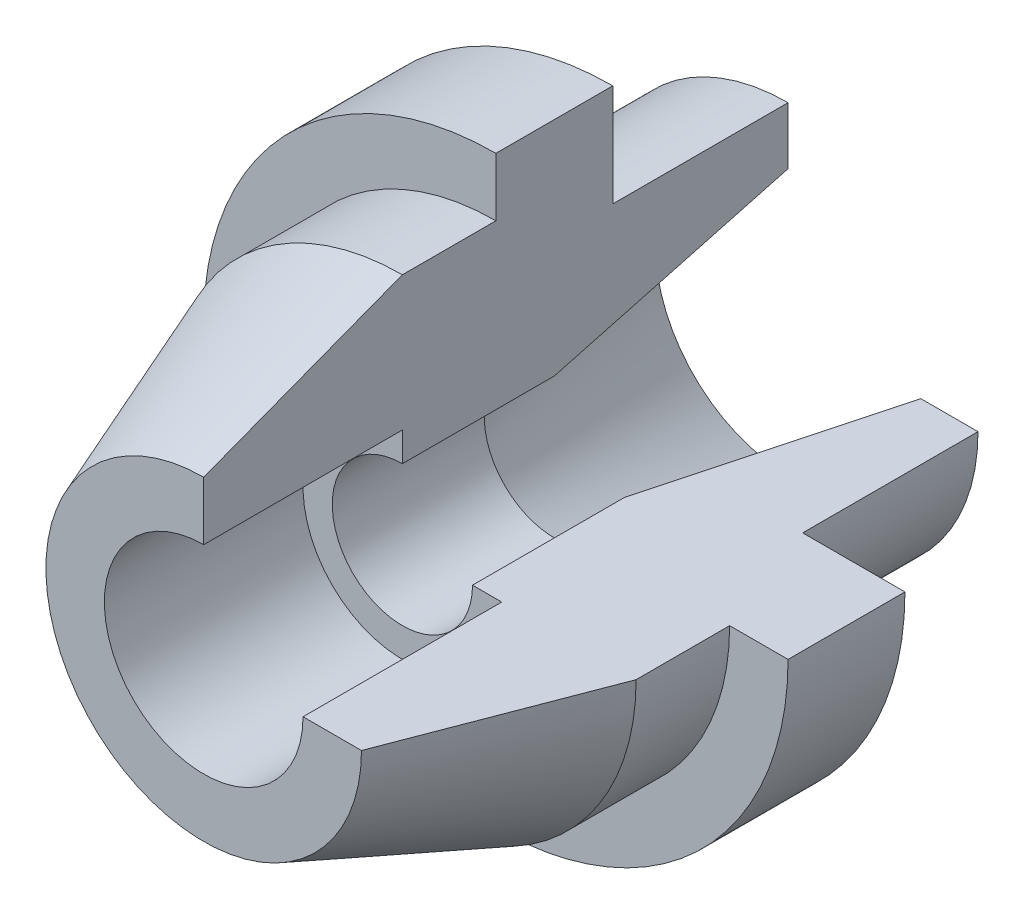
ISO-10303-21;
HEADER;
FILE_DESCRIPTION(('STEP AP214'),'2;1');
FILE_NAME('part.step','',(''),(''),'','','');
FILE_SCHEMA(('AUTOMOTIVE_DESIGN { 1 0 10303 214 1 1 1 1 }'));
ENDSEC;
DATA;
#1=APPLICATION_CONTEXT('core data for automotive mechanical design processes');
#2=APPLICATION_PROTOCOL_DEFINITION('international standard','automotive_design',2000,#1);
#3=PRODUCT_CONTEXT('',#1,'mechanical');
#4=PRODUCT('Part','Part','',(#3));
#5=PRODUCT_RELATED_PRODUCT_CATEGORY('part','',(#4));
#6=PRODUCT_DEFINITION_FORMATION('','',#4);
#7=PRODUCT_DEFINITION_CONTEXT('part definition',#1,'design');
#8=PRODUCT_DEFINITION('design','',#6,#7);
#9=PRODUCT_DEFINITION_SHAPE('','',#8);
#10=(LENGTH_UNIT() NAMED_UNIT(*) SI_UNIT(.MILLI.,.METRE.));
#11=(NAMED_UNIT(*) PLANE_ANGLE_UNIT() SI_UNIT($,.RADIAN.));
#12=(NAMED_UNIT(*) SI_UNIT($,.STERADIAN.) SOLID_ANGLE_UNIT());
#13=UNCERTAINTY_MEASURE_WITH_UNIT(LENGTH_MEASURE(1.E-05),#10,'distance_accuracy_value','');
#14=(GEOMETRIC_REPRESENTATION_CONTEXT(3) GLOBAL_UNCERTAINTY_ASSIGNED_CONTEXT((#13)) GLOBAL_UNIT_ASSIGNED_CONTEXT((#10,
#11,#12)) REPRESENTATION_CONTEXT('',''));
#15=CARTESIAN_POINT('',(0.,0.,0.));
#16=DIRECTION('',(0.,0.,1.));
#17=DIRECTION('',(1.,0.,0.));
#18=AXIS2_PLACEMENT_3D('',#15,#16,#17);
#19=CARTESIAN_POINT('',(0.,0.,0.));
#20=DIRECTION('',(0.,1.,0.));
#21=DIRECTION('',(0.,0.,1.));
#22=AXIS2_PLACEMENT_3D('',#19,#20,#21);
#23=PLANE('',#22);
#24=DIRECTION('',(1.,0.,0.));
#25=VECTOR('',#24,1.);
#26=CARTESIAN_POINT('',(0.,0.,-34.));
#27=LINE('',#26,#25);
#28=CARTESIAN_POINT('',(11.9999999999998,1.25547595229252E-13,-34.));
#29=VERTEX_POINT('',#28);
#30=CARTESIAN_POINT('',(17.0000000000001,1.77919815311902E-13,-34.));
#31=VERTEX_POINT('',#30);
#32=EDGE_CURVE('E145',#29,#31,#27,.T.);
#33=ORIENTED_EDGE('',*,*,#32,.T.);
#34=DIRECTION('',(0.,0.,1.));
#35=VECTOR('',#34,1.);
#36=CARTESIAN_POINT('',(17.,1.78065548281E-13,0.));
#37=LINE('',#36,#35);
#38=CARTESIAN_POINT('',(17.,1.78065548281E-13,0.));
#39=VERTEX_POINT('',#38);
#40=EDGE_CURVE('E126',#31,#39,#37,.T.);
#41=ORIENTED_EDGE('',*,*,#40,.T.);
#42=DIRECTION('',(-1.,0.,0.));
#43=VECTOR('',#42,1.);
#44=CARTESIAN_POINT('',(0.,0.,0.));
#45=LINE('',#44,#43);
#46=CARTESIAN_POINT('',(27.,2.82809988446294E-13,0.));
#47=VERTEX_POINT('',#46);
#48=EDGE_CURVE('E200',#47,#39,#45,.T.);
#49=ORIENTED_EDGE('',*,*,#48,.F.);
#50=DIRECTION('',(-0.357137466266591,0.,0.934051834851085));
#51=VECTOR('',#50,1.);
#52=CARTESIAN_POINT('',(27.,2.82809988446294E-13,0.));
#53=LINE('',#52,#51);
#54=CARTESIAN_POINT('',(40.,4.18832027692077E-13,-34.));
#55=VERTEX_POINT('',#54);
#56=EDGE_CURVE('E193',#55,#47,#53,.T.);
#57=ORIENTED_EDGE('',*,*,#56,.F.);
#58=DIRECTION('',(0.,0.,1.));
#59=VECTOR('',#58,1.);
#60=CARTESIAN_POINT('',(40.,4.18832027692077E-13,-34.));
#61=LINE('',#60,#59);
#62=CARTESIAN_POINT('',(40.,4.18763447471325E-13,-50.));
#63=VERTEX_POINT('',#62);
#64=EDGE_CURVE('E195',#63,#55,#61,.T.);
#65=ORIENTED_EDGE('',*,*,#64,.F.);
#66=DIRECTION('',(-1.,0.,0.));
#67=VECTOR('',#66,1.);
#68=CARTESIAN_POINT('',(40.,4.18763447471325E-13,-50.));
#69=LINE('',#68,#67);
#70=CARTESIAN_POINT('',(50.,5.23507887636619E-13,-50.));
#71=VERTEX_POINT('',#70);
#72=EDGE_CURVE('E188',#71,#63,#69,.T.);
#73=ORIENTED_EDGE('',*,*,#72,.F.);
#74=DIRECTION('',(0.,0.,1.));
#75=VECTOR('',#74,1.);
#76=CARTESIAN_POINT('',(50.,5.23507887636619E-13,-50.));
#77=LINE('',#76,#75);
#78=CARTESIAN_POINT('',(50.,5.23422162360679E-13,-70.));
#79=VERTEX_POINT('',#78);
#80=EDGE_CURVE('E186',#79,#71,#77,.T.);
#81=ORIENTED_EDGE('',*,*,#80,.F.);
#82=DIRECTION('',(1.,0.,0.));
#83=VECTOR('',#82,1.);
#84=CARTESIAN_POINT('',(50.,5.23422162360679E-13,-70.));
#85=LINE('',#84,#83);
#86=CARTESIAN_POINT('',(32.5,3.40119392071414E-13,-70.));
#87=VERTEX_POINT('',#86);
#88=EDGE_CURVE('E183',#87,#79,#85,.T.);
#89=ORIENTED_EDGE('',*,*,#88,.F.);
#90=DIRECTION('',(0.,0.,1.));
#91=VECTOR('',#90,1.);
#92=CARTESIAN_POINT('',(32.5,3.40119392071414E-13,-70.));
#93=LINE('',#92,#91);
#94=CARTESIAN_POINT('',(32.5,3.39990804157504E-13,-100.));
#95=VERTEX_POINT('',#94);
#96=EDGE_CURVE('E179',#95,#87,#93,.T.);
#97=ORIENTED_EDGE('',*,*,#96,.F.);
#98=DIRECTION('',(1.,0.,0.));
#99=VECTOR('',#98,1.);
#100=CARTESIAN_POINT('',(32.5,3.39990804157504E-13,-100.));
#101=LINE('',#100,#99);
#102=CARTESIAN_POINT('',(22.7179676972446,2.37529454434411E-13,-99.9999999999999));
#103=VERTEX_POINT('',#102);
#104=EDGE_CURVE('E178',#103,#95,#101,.T.);
#105=ORIENTED_EDGE('',*,*,#104,.F.);
#106=DIRECTION('',(0.258819045102517,0.,-0.965925826289069));
#107=VECTOR('',#106,1.);
#108=CARTESIAN_POINT('',(0.,0.,-15.2153903091732));
#109=LINE('',#108,#107);
#110=CARTESIAN_POINT('',(11.9999999999999,0.,-60.));
#111=VERTEX_POINT('',#110);
#112=EDGE_CURVE('E137',#103,#111,#109,.F.);
#113=ORIENTED_EDGE('',*,*,#112,.T.);
#114=DIRECTION('',(0.,0.,1.));
#115=VECTOR('',#114,1.);
#116=CARTESIAN_POINT('',(11.9999999999998,1.25693328198351E-13,0.));
#117=LINE('',#116,#115);
#118=EDGE_CURVE('E149',#111,#29,#117,.T.);
#119=ORIENTED_EDGE('',*,*,#118,.T.);
#120=EDGE_LOOP('',(#33,#41,#49,#57,#65,#73,#81,#89,#97,#105,#113,#119));
#121=FACE_BOUND('',#120,.T.);
#122=ADVANCED_FACE('F39',(#121),#23,.T.);
#123=CARTESIAN_POINT('',(0.,0.,0.));
#124=DIRECTION('',(-1.,0.,0.));
#125=DIRECTION('',(0.,0.,1.));
#126=AXIS2_PLACEMENT_3D('',#123,#124,#125);
#127=PLANE('',#126);
#128=DIRECTION('',(0.,0.,1.));
#129=VECTOR('',#128,1.);
#130=CARTESIAN_POINT('',(0.,17.0000000000003,0.));
#131=LINE('',#130,#129);
#132=CARTESIAN_POINT('',(0.,17.0000000000003,-34.));
#133=VERTEX_POINT('',#132);
#134=CARTESIAN_POINT('',(0.,17.0000000000003,0.));
#135=VERTEX_POINT('',#134);
#136=EDGE_CURVE('E11',#133,#135,#131,.T.);
#137=ORIENTED_EDGE('',*,*,#136,.F.);
#138=DIRECTION('',(0.,1.,0.));
#139=VECTOR('',#138,1.);
#140=CARTESIAN_POINT('',(0.,0.,-34.));
#141=LINE('',#140,#139);
#142=CARTESIAN_POINT('',(0.,12.,-34.));
#143=VERTEX_POINT('',#142);
#144=EDGE_CURVE('E143',#143,#133,#141,.T.);
#145=ORIENTED_EDGE('',*,*,#144,.F.);
#146=DIRECTION('',(0.,0.,1.));
#147=VECTOR('',#146,1.);
#148=CARTESIAN_POINT('',(0.,12.0000000000001,0.));
#149=LINE('',#148,#147);
#150=CARTESIAN_POINT('',(0.,12.,-60.));
#151=VERTEX_POINT('',#150);
#152=EDGE_CURVE('E215',#151,#143,#149,.T.);
#153=ORIENTED_EDGE('',*,*,#152,.F.);
#154=DIRECTION('',(0.,0.258819045102515,-0.96592582628907));
#155=VECTOR('',#154,1.);
#156=CARTESIAN_POINT('',(0.,2.39779344870862E-13,-15.2153903091732));
#157=LINE('',#156,#155);
#158=CARTESIAN_POINT('',(0.,22.7179676972446,-100.));
#159=VERTEX_POINT('',#158);
#160=EDGE_CURVE('E50',#159,#151,#157,.F.);
#161=ORIENTED_EDGE('',*,*,#160,.F.);
#162=DIRECTION('',(0.,1.,0.));
#163=VECTOR('',#162,1.);
#164=CARTESIAN_POINT('',(0.,32.5,-100.));
#165=LINE('',#164,#163);
#166=CARTESIAN_POINT('',(0.,32.5,-100.));
#167=VERTEX_POINT('',#166);
#168=EDGE_CURVE('E138',#159,#167,#165,.T.);
#169=ORIENTED_EDGE('',*,*,#168,.T.);
#170=DIRECTION('',(0.,0.,1.));
#171=VECTOR('',#170,1.);
#172=CARTESIAN_POINT('',(0.,32.5,-70.));
#173=LINE('',#172,#171);
#174=CARTESIAN_POINT('',(0.,32.5,-70.));
#175=VERTEX_POINT('',#174);
#176=EDGE_CURVE('E160',#167,#175,#173,.T.);
#177=ORIENTED_EDGE('',*,*,#176,.T.);
#178=DIRECTION('',(0.,1.,0.));
#179=VECTOR('',#178,1.);
#180=CARTESIAN_POINT('',(0.,50.,-70.));
#181=LINE('',#180,#179);
#182=CARTESIAN_POINT('',(0.,50.,-70.));
#183=VERTEX_POINT('',#182);
#184=EDGE_CURVE('E158',#175,#183,#181,.T.);
#185=ORIENTED_EDGE('',*,*,#184,.T.);
#186=DIRECTION('',(0.,0.,1.));
#187=VECTOR('',#186,1.);
#188=CARTESIAN_POINT('',(0.,50.,-50.));
#189=LINE('',#188,#187);
#190=CARTESIAN_POINT('',(0.,50.,-50.));
#191=VERTEX_POINT('',#190);
#192=EDGE_CURVE('E161',#183,#191,#189,.T.);
#193=ORIENTED_EDGE('',*,*,#192,.T.);
#194=DIRECTION('',(0.,-1.,0.));
#195=VECTOR('',#194,1.);
#196=CARTESIAN_POINT('',(0.,40.,-50.));
#197=LINE('',#196,#195);
#198=CARTESIAN_POINT('',(0.,40.,-50.));
#199=VERTEX_POINT('',#198);
#200=EDGE_CURVE('E168',#191,#199,#197,.T.);
#201=ORIENTED_EDGE('',*,*,#200,.T.);
#202=DIRECTION('',(0.,0.,1.));
#203=VECTOR('',#202,1.);
#204=CARTESIAN_POINT('',(0.,40.,-34.));
#205=LINE('',#204,#203);
#206=CARTESIAN_POINT('',(0.,40.,-34.));
#207=VERTEX_POINT('',#206);
#208=EDGE_CURVE('E170',#199,#207,#205,.T.);
#209=ORIENTED_EDGE('',*,*,#208,.T.);
#210=DIRECTION('',(0.,-0.357137466266591,0.934051834851085));
#211=VECTOR('',#210,1.);
#212=CARTESIAN_POINT('',(0.,27.,0.));
#213=LINE('',#212,#211);
#214=CARTESIAN_POINT('',(0.,27.,0.));
#215=VERTEX_POINT('',#214);
#216=EDGE_CURVE('E175',#207,#215,#213,.T.);
#217=ORIENTED_EDGE('',*,*,#216,.T.);
#218=DIRECTION('',(0.,-1.,0.));
#219=VECTOR('',#218,1.);
#220=CARTESIAN_POINT('',(0.,0.,0.));
#221=LINE('',#220,#219);
#222=EDGE_CURVE('E172',#215,#135,#221,.T.);
#223=ORIENTED_EDGE('',*,*,#222,.T.);
#224=EDGE_LOOP('',(#137,#145,#153,#161,#169,#177,#185,#193,#201,#209,#217,#223));
#225=FACE_BOUND('',#224,.T.);
#226=ADVANCED_FACE('F228',(#225),#127,.F.);
#227=CARTESIAN_POINT('',(0.,0.,0.));
#228=DIRECTION('',(0.,0.,1.));
#229=DIRECTION('',(0.,-1.,0.));
#230=AXIS2_PLACEMENT_3D('',#227,#228,#229);
#231=PLANE('',#230);
#232=ORIENTED_EDGE('',*,*,#48,.T.);
#233=CARTESIAN_POINT('',(0.,2.82809988446294E-13,0.));
#234=DIRECTION('',(0.,0.,1.));
#235=DIRECTION('',(0.,-1.,0.));
#236=AXIS2_PLACEMENT_3D('',#233,#234,#235);
#237=CIRCLE('',#236,17.);
#238=EDGE_CURVE('E132',#135,#39,#237,.T.);
#239=ORIENTED_EDGE('',*,*,#238,.F.);
#240=ORIENTED_EDGE('',*,*,#222,.F.);
#241=CARTESIAN_POINT('',(0.,0.,0.));
#242=DIRECTION('',(0.,0.,-1.));
#243=DIRECTION('',(0.,1.,0.));
#244=AXIS2_PLACEMENT_3D('',#241,#242,#243);
#245=CIRCLE('',#244,27.);
#246=EDGE_CURVE('E65',#47,#215,#245,.T.);
#247=ORIENTED_EDGE('',*,*,#246,.F.);
#248=EDGE_LOOP('',(#232,#239,#240,#247));
#249=FACE_BOUND('',#248,.T.);
#250=ADVANCED_FACE('F41',(#249),#231,.T.);
#251=CARTESIAN_POINT('',(0.,0.,-34.));
#252=DIRECTION('',(0.,0.,-1.));
#253=DIRECTION('',(0.,1.,0.));
#254=AXIS2_PLACEMENT_3D('',#251,#252,#253);
#255=CONICAL_SURFACE('',#254,40.,0.365201449788173);
#256=CARTESIAN_POINT('',(0.,0.,-34.));
#257=DIRECTION('',(0.,0.,-1.));
#258=DIRECTION('',(0.,1.,0.));
#259=AXIS2_PLACEMENT_3D('',#256,#257,#258);
#260=CIRCLE('',#259,40.);
#261=EDGE_CURVE('E209',#55,#207,#260,.T.);
#262=ORIENTED_EDGE('',*,*,#261,.F.);
#263=ORIENTED_EDGE('',*,*,#56,.T.);
#264=ORIENTED_EDGE('',*,*,#246,.T.);
#265=ORIENTED_EDGE('',*,*,#216,.F.);
#266=EDGE_LOOP('',(#262,#263,#264,#265));
#267=FACE_BOUND('',#266,.T.);
#268=ADVANCED_FACE('F232',(#267),#255,.T.);
#269=CARTESIAN_POINT('',(0.,0.,-100.));
#270=DIRECTION('',(0.,0.,-1.));
#271=DIRECTION('',(0.,1.,0.));
#272=AXIS2_PLACEMENT_3D('',#269,#270,#271);
#273=CYLINDRICAL_SURFACE('',#272,40.);
#274=CARTESIAN_POINT('',(0.,0.,-50.));
#275=DIRECTION('',(0.,0.,-1.));
#276=DIRECTION('',(0.,1.,0.));
#277=AXIS2_PLACEMENT_3D('',#274,#275,#276);
#278=CIRCLE('',#277,40.);
#279=EDGE_CURVE('E206',#63,#199,#278,.T.);
#280=ORIENTED_EDGE('',*,*,#279,.F.);
#281=ORIENTED_EDGE('',*,*,#64,.T.);
#282=ORIENTED_EDGE('',*,*,#261,.T.);
#283=ORIENTED_EDGE('',*,*,#208,.F.);
#284=EDGE_LOOP('',(#280,#281,#282,#283));
#285=FACE_BOUND('',#284,.T.);
#286=ADVANCED_FACE('F240',(#285),#273,.T.);
#287=CARTESIAN_POINT('',(40.,4.18763447471325E-13,-50.));
#288=DIRECTION('',(0.,0.,1.));
#289=DIRECTION('',(0.,-1.,0.));
#290=AXIS2_PLACEMENT_3D('',#287,#288,#289);
#291=PLANE('',#290);
#292=CARTESIAN_POINT('',(0.,0.,-50.));
#293=DIRECTION('',(0.,0.,-1.));
#294=DIRECTION('',(0.,1.,0.));
#295=AXIS2_PLACEMENT_3D('',#292,#293,#294);
#296=CIRCLE('',#295,50.);
#297=EDGE_CURVE('E208',#71,#191,#296,.T.);
#298=ORIENTED_EDGE('',*,*,#297,.F.);
#299=ORIENTED_EDGE('',*,*,#72,.T.);
#300=ORIENTED_EDGE('',*,*,#279,.T.);
#301=ORIENTED_EDGE('',*,*,#200,.F.);
#302=EDGE_LOOP('',(#298,#299,#300,#301));
#303=FACE_BOUND('',#302,.T.);
#304=ADVANCED_FACE('F238',(#303),#291,.T.);
#305=CARTESIAN_POINT('',(0.,0.,-100.));
#306=DIRECTION('',(0.,0.,-1.));
#307=DIRECTION('',(0.,1.,0.));
#308=AXIS2_PLACEMENT_3D('',#305,#306,#307);
#309=CYLINDRICAL_SURFACE('',#308,50.);
#310=CARTESIAN_POINT('',(0.,0.,-70.));
#311=DIRECTION('',(0.,0.,-1.));
#312=DIRECTION('',(0.,1.,0.));
#313=AXIS2_PLACEMENT_3D('',#310,#311,#312);
#314=CIRCLE('',#313,50.);
#315=EDGE_CURVE('E204',#79,#183,#314,.T.);
#316=ORIENTED_EDGE('',*,*,#315,.F.);
#317=ORIENTED_EDGE('',*,*,#80,.T.);
#318=ORIENTED_EDGE('',*,*,#297,.T.);
#319=ORIENTED_EDGE('',*,*,#192,.F.);
#320=EDGE_LOOP('',(#316,#317,#318,#319));
#321=FACE_BOUND('',#320,.T.);
#322=ADVANCED_FACE('F244',(#321),#309,.T.);
#323=CARTESIAN_POINT('',(50.,5.23422162360679E-13,-70.));
#324=DIRECTION('',(0.,0.,-1.));
#325=DIRECTION('',(0.,1.,0.));
#326=AXIS2_PLACEMENT_3D('',#323,#324,#325);
#327=PLANE('',#326);
#328=CARTESIAN_POINT('',(0.,0.,-70.));
#329=DIRECTION('',(0.,0.,-1.));
#330=DIRECTION('',(0.,1.,0.));
#331=AXIS2_PLACEMENT_3D('',#328,#329,#330);
#332=CIRCLE('',#331,32.5);
#333=EDGE_CURVE('E205',#87,#175,#332,.T.);
#334=ORIENTED_EDGE('',*,*,#333,.F.);
#335=ORIENTED_EDGE('',*,*,#88,.T.);
#336=ORIENTED_EDGE('',*,*,#315,.T.);
#337=ORIENTED_EDGE('',*,*,#184,.F.);
#338=EDGE_LOOP('',(#334,#335,#336,#337));
#339=FACE_BOUND('',#338,.T.);
#340=ADVANCED_FACE('F249',(#339),#327,.T.);
#341=CARTESIAN_POINT('',(0.,0.,-100.));
#342=DIRECTION('',(0.,0.,-1.));
#343=DIRECTION('',(0.,1.,0.));
#344=AXIS2_PLACEMENT_3D('',#341,#342,#343);
#345=CYLINDRICAL_SURFACE('',#344,32.5);
#346=CARTESIAN_POINT('',(0.,0.,-100.));
#347=DIRECTION('',(0.,0.,-1.));
#348=DIRECTION('',(0.,1.,0.));
#349=AXIS2_PLACEMENT_3D('',#346,#347,#348);
#350=CIRCLE('',#349,32.5);
#351=EDGE_CURVE('E197',#95,#167,#350,.T.);
#352=ORIENTED_EDGE('',*,*,#351,.F.);
#353=ORIENTED_EDGE('',*,*,#96,.T.);
#354=ORIENTED_EDGE('',*,*,#333,.T.);
#355=ORIENTED_EDGE('',*,*,#176,.F.);
#356=EDGE_LOOP('',(#352,#353,#354,#355));
#357=FACE_BOUND('',#356,.T.);
#358=ADVANCED_FACE('F251',(#357),#345,.T.);
#359=CARTESIAN_POINT('',(32.5,3.39990804157504E-13,-100.));
#360=DIRECTION('',(0.,0.,-1.));
#361=DIRECTION('',(0.,1.,0.));
#362=AXIS2_PLACEMENT_3D('',#359,#360,#361);
#363=PLANE('',#362);
#364=ORIENTED_EDGE('',*,*,#168,.F.);
#365=CARTESIAN_POINT('',(0.,0.,-99.9999999999999));
#366=DIRECTION('',(0.,0.,1.));
#367=DIRECTION('',(0.,-1.,0.));
#368=AXIS2_PLACEMENT_3D('',#365,#366,#367);
#369=CIRCLE('',#368,22.7179676972446);
#370=EDGE_CURVE('E153',#159,#103,#369,.T.);
#371=ORIENTED_EDGE('',*,*,#370,.T.);
#372=ORIENTED_EDGE('',*,*,#104,.T.);
#373=ORIENTED_EDGE('',*,*,#351,.T.);
#374=EDGE_LOOP('',(#364,#371,#372,#373));
#375=FACE_BOUND('',#374,.T.);
#376=ADVANCED_FACE('F258',(#375),#363,.T.);
#377=CARTESIAN_POINT('',(0.,2.82809988446294E-13,0.));
#378=DIRECTION('',(0.,0.,1.));
#379=DIRECTION('',(0.,-1.,0.));
#380=AXIS2_PLACEMENT_3D('',#377,#378,#379);
#381=CYLINDRICAL_SURFACE('',#380,17.);
#382=CARTESIAN_POINT('',(0.,1.86654592374554E-13,-34.));
#383=DIRECTION('',(0.,0.,1.));
#384=DIRECTION('',(0.,-1.,0.));
#385=AXIS2_PLACEMENT_3D('',#382,#383,#384);
#386=CIRCLE('',#385,17.0000000000001);
#387=EDGE_CURVE('E131',#133,#31,#386,.T.);
#388=ORIENTED_EDGE('',*,*,#387,.F.);
#389=ORIENTED_EDGE('',*,*,#136,.T.);
#390=ORIENTED_EDGE('',*,*,#238,.T.);
#391=ORIENTED_EDGE('',*,*,#40,.F.);
#392=EDGE_LOOP('',(#388,#389,#390,#391));
#393=FACE_BOUND('',#392,.T.);
#394=ADVANCED_FACE('F127',(#393),#381,.F.);
#395=CARTESIAN_POINT('',(0.,0.,-99.9999999999999));
#396=DIRECTION('',(0.,0.,-1.));
#397=DIRECTION('',(0.,1.,0.));
#398=AXIS2_PLACEMENT_3D('',#395,#396,#397);
#399=CONICAL_SURFACE('',#398,22.7179676972446,0.261799387799146);
#400=ORIENTED_EDGE('',*,*,#370,.F.);
#401=ORIENTED_EDGE('',*,*,#160,.T.);
#402=CARTESIAN_POINT('',(0.,1.13123995378518E-13,-60.));
#403=DIRECTION('',(0.,0.,1.));
#404=DIRECTION('',(0.,-1.,0.));
#405=AXIS2_PLACEMENT_3D('',#402,#403,#404);
#406=CIRCLE('',#405,11.9999999999999);
#407=EDGE_CURVE('E217',#151,#111,#406,.T.);
#408=ORIENTED_EDGE('',*,*,#407,.T.);
#409=ORIENTED_EDGE('',*,*,#112,.F.);
#410=EDGE_LOOP('',(#400,#401,#408,#409));
#411=FACE_BOUND('',#410,.T.);
#412=ADVANCED_FACE('F219',(#411),#399,.F.);
#413=CARTESIAN_POINT('',(0.,2.82809988446294E-13,0.));
#414=DIRECTION('',(0.,0.,1.));
#415=DIRECTION('',(0.,-1.,0.));
#416=AXIS2_PLACEMENT_3D('',#413,#414,#415);
#417=CYLINDRICAL_SURFACE('',#416,11.9999999999998);
#418=ORIENTED_EDGE('',*,*,#407,.F.);
#419=ORIENTED_EDGE('',*,*,#152,.T.);
#420=CARTESIAN_POINT('',(0.,1.86654592374554E-13,-34.));
#421=DIRECTION('',(0.,0.,1.));
#422=DIRECTION('',(0.,-1.,0.));
#423=AXIS2_PLACEMENT_3D('',#420,#421,#422);
#424=CIRCLE('',#423,11.9999999999998);
#425=EDGE_CURVE('E53',#143,#29,#424,.T.);
#426=ORIENTED_EDGE('',*,*,#425,.T.);
#427=ORIENTED_EDGE('',*,*,#118,.F.);
#428=EDGE_LOOP('',(#418,#419,#426,#427));
#429=FACE_BOUND('',#428,.T.);
#430=ADVANCED_FACE('F226',(#429),#417,.F.);
#431=CARTESIAN_POINT('',(0.,12.,-34.));
#432=DIRECTION('',(0.,0.,1.));
#433=DIRECTION('',(0.,-1.,0.));
#434=AXIS2_PLACEMENT_3D('',#431,#432,#433);
#435=PLANE('',#434);
#436=ORIENTED_EDGE('',*,*,#425,.F.);
#437=ORIENTED_EDGE('',*,*,#144,.T.);
#438=ORIENTED_EDGE('',*,*,#387,.T.);
#439=ORIENTED_EDGE('',*,*,#32,.F.);
#440=EDGE_LOOP('',(#436,#437,#438,#439));
#441=FACE_BOUND('',#440,.T.);
#442=ADVANCED_FACE('F141',(#441),#435,.T.);
#443=CLOSED_SHELL('',(#122,#226,#250,#268,#286,#304,#322,#340,#358,#376,#394,#412,#430,#442));
#444=MANIFOLD_SOLID_BREP('B2',#443);
#445=ADVANCED_BREP_SHAPE_REPRESENTATION('',(#18,#444),#14);
#446=SHAPE_DEFINITION_REPRESENTATION(#9,#445);
ENDSEC;
END-ISO-10303-21;
